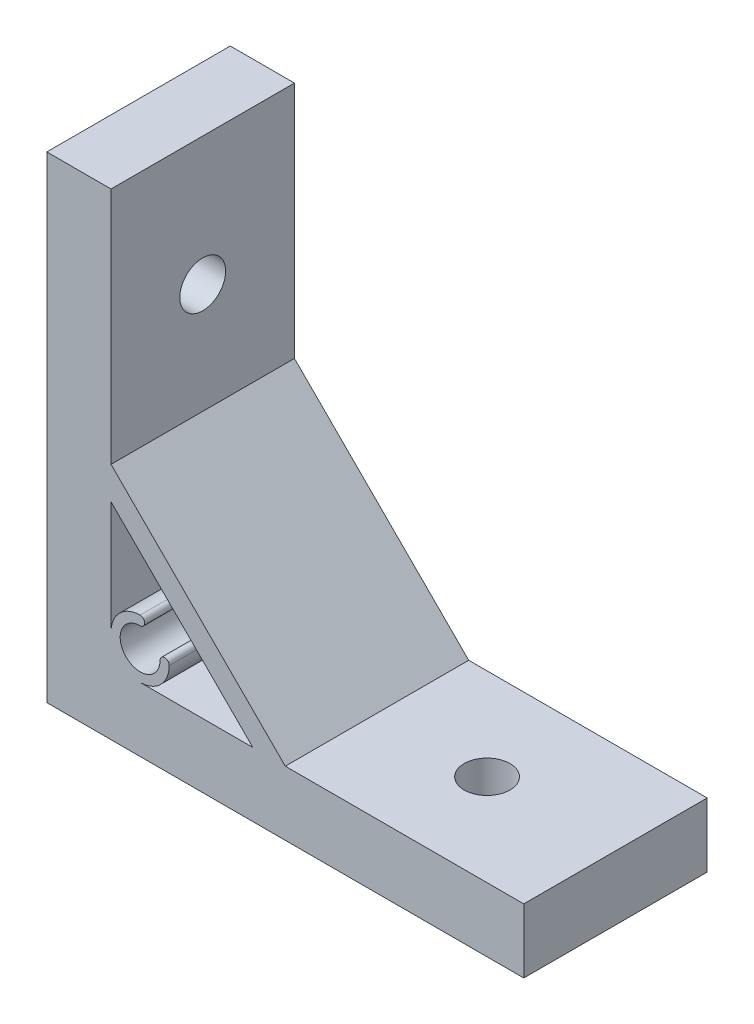
ISO-10303-21;
HEADER;
FILE_DESCRIPTION(('STEP AP214'),'2;1');
FILE_NAME('part.step','',(''),(''),'','','');
FILE_SCHEMA(('AUTOMOTIVE_DESIGN { 1 0 10303 214 1 1 1 1 }'));
ENDSEC;
DATA;
#1=APPLICATION_CONTEXT('core data for automotive mechanical design processes');
#2=APPLICATION_PROTOCOL_DEFINITION('international standard','automotive_design',2000,#1);
#3=PRODUCT_CONTEXT('',#1,'mechanical');
#4=PRODUCT('Part','Part','',(#3));
#5=PRODUCT_RELATED_PRODUCT_CATEGORY('part','',(#4));
#6=PRODUCT_DEFINITION_FORMATION('','',#4);
#7=PRODUCT_DEFINITION_CONTEXT('part definition',#1,'design');
#8=PRODUCT_DEFINITION('design','',#6,#7);
#9=PRODUCT_DEFINITION_SHAPE('','',#8);
#10=(LENGTH_UNIT() NAMED_UNIT(*) SI_UNIT(.MILLI.,.METRE.));
#11=(NAMED_UNIT(*) PLANE_ANGLE_UNIT() SI_UNIT($,.RADIAN.));
#12=(NAMED_UNIT(*) SI_UNIT($,.STERADIAN.) SOLID_ANGLE_UNIT());
#13=UNCERTAINTY_MEASURE_WITH_UNIT(LENGTH_MEASURE(1.E-05),#10,'distance_accuracy_value','');
#14=(GEOMETRIC_REPRESENTATION_CONTEXT(3) GLOBAL_UNCERTAINTY_ASSIGNED_CONTEXT((#13)) GLOBAL_UNIT_ASSIGNED_CONTEXT((#10,
#11,#12)) REPRESENTATION_CONTEXT('',''));
#15=CARTESIAN_POINT('',(0.,0.,0.));
#16=DIRECTION('',(0.,0.,1.));
#17=DIRECTION('',(1.,0.,0.));
#18=AXIS2_PLACEMENT_3D('',#15,#16,#17);
#19=CARTESIAN_POINT('',(10.175,12.85,20.));
#20=DIRECTION('',(0.,0.,-1.));
#21=DIRECTION('',(-1.,0.,0.));
#22=AXIS2_PLACEMENT_3D('',#19,#20,#21);
#23=CYLINDRICAL_SURFACE('',#22,0.5);
#24=CARTESIAN_POINT('',(10.175,12.85,0.));
#25=DIRECTION('',(0.,0.,1.));
#26=DIRECTION('',(1.,0.,0.));
#27=AXIS2_PLACEMENT_3D('',#24,#25,#26);
#28=CIRCLE('',#27,0.5);
#29=CARTESIAN_POINT('',(10.175,12.35,0.));
#30=VERTEX_POINT('',#29);
#31=CARTESIAN_POINT('',(10.175,13.35,0.));
#32=VERTEX_POINT('',#31);
#33=EDGE_CURVE('E208',#30,#32,#28,.T.);
#34=ORIENTED_EDGE('',*,*,#33,.T.);
#35=DIRECTION('',(0.,0.,-1.));
#36=VECTOR('',#35,1.);
#37=CARTESIAN_POINT('',(10.175,13.35,20.));
#38=LINE('',#37,#36);
#39=CARTESIAN_POINT('',(10.175,13.35,20.));
#40=VERTEX_POINT('',#39);
#41=EDGE_CURVE('E11',#40,#32,#38,.T.);
#42=ORIENTED_EDGE('',*,*,#41,.F.);
#43=CARTESIAN_POINT('',(10.175,12.85,20.));
#44=DIRECTION('',(0.,0.,1.));
#45=DIRECTION('',(1.,0.,0.));
#46=AXIS2_PLACEMENT_3D('',#43,#44,#45);
#47=CIRCLE('',#46,0.5);
#48=CARTESIAN_POINT('',(10.175,12.35,20.));
#49=VERTEX_POINT('',#48);
#50=EDGE_CURVE('E294',#49,#40,#47,.T.);
#51=ORIENTED_EDGE('',*,*,#50,.F.);
#52=DIRECTION('',(0.,0.,-1.));
#53=VECTOR('',#52,1.);
#54=CARTESIAN_POINT('',(10.175,12.35,20.));
#55=LINE('',#54,#53);
#56=EDGE_CURVE('E62',#49,#30,#55,.T.);
#57=ORIENTED_EDGE('',*,*,#56,.T.);
#58=EDGE_LOOP('',(#34,#42,#51,#57));
#59=FACE_BOUND('',#58,.T.);
#60=ADVANCED_FACE('F43',(#59),#23,.T.);
#61=CARTESIAN_POINT('',(10.175,10.175,20.));
#62=DIRECTION('',(0.,0.,-1.));
#63=DIRECTION('',(-1.,0.,0.));
#64=AXIS2_PLACEMENT_3D('',#61,#62,#63);
#65=CYLINDRICAL_SURFACE('',#64,3.175);
#66=CARTESIAN_POINT('',(10.175,10.175,0.));
#67=DIRECTION('',(0.,0.,1.));
#68=DIRECTION('',(1.,0.,0.));
#69=AXIS2_PLACEMENT_3D('',#66,#67,#68);
#70=CIRCLE('',#69,3.175);
#71=CARTESIAN_POINT('',(7.00000000000001,10.175,0.));
#72=VERTEX_POINT('',#71);
#73=EDGE_CURVE('E210',#32,#72,#70,.T.);
#74=ORIENTED_EDGE('',*,*,#73,.T.);
#75=DIRECTION('',(0.,0.,-1.));
#76=VECTOR('',#75,1.);
#77=CARTESIAN_POINT('',(7.00000000000001,10.175,20.));
#78=LINE('',#77,#76);
#79=CARTESIAN_POINT('',(7.00000000000001,10.175,20.));
#80=VERTEX_POINT('',#79);
#81=EDGE_CURVE('E53',#80,#72,#78,.T.);
#82=ORIENTED_EDGE('',*,*,#81,.F.);
#83=CARTESIAN_POINT('',(10.175,10.175,20.));
#84=DIRECTION('',(0.,0.,1.));
#85=DIRECTION('',(1.,0.,0.));
#86=AXIS2_PLACEMENT_3D('',#83,#84,#85);
#87=CIRCLE('',#86,3.175);
#88=EDGE_CURVE('E296',#40,#80,#87,.T.);
#89=ORIENTED_EDGE('',*,*,#88,.F.);
#90=ORIENTED_EDGE('',*,*,#41,.T.);
#91=EDGE_LOOP('',(#74,#82,#89,#90));
#92=FACE_BOUND('',#91,.T.);
#93=ADVANCED_FACE('F319',(#92),#65,.T.);
#94=CARTESIAN_POINT('',(7.00000000000001,0.,20.));
#95=DIRECTION('',(1.,0.,0.));
#96=DIRECTION('',(0.,0.,-1.));
#97=AXIS2_PLACEMENT_3D('',#94,#95,#96);
#98=PLANE('',#97);
#99=DIRECTION('',(0.,-1.,0.));
#100=VECTOR('',#99,1.);
#101=CARTESIAN_POINT('',(7.00000000000001,0.,0.));
#102=LINE('',#101,#100);
#103=CARTESIAN_POINT('',(7.00000000000001,22.4644660940699,0.));
#104=VERTEX_POINT('',#103);
#105=EDGE_CURVE('E213',#104,#72,#102,.T.);
#106=ORIENTED_EDGE('',*,*,#105,.F.);
#107=DIRECTION('',(0.,0.,-1.));
#108=VECTOR('',#107,1.);
#109=CARTESIAN_POINT('',(7.00000000000001,22.4644660940699,20.));
#110=LINE('',#109,#108);
#111=CARTESIAN_POINT('',(7.00000000000001,22.4644660940699,20.));
#112=VERTEX_POINT('',#111);
#113=EDGE_CURVE('E234',#112,#104,#110,.T.);
#114=ORIENTED_EDGE('',*,*,#113,.F.);
#115=DIRECTION('',(0.,-1.,0.));
#116=VECTOR('',#115,1.);
#117=CARTESIAN_POINT('',(7.00000000000001,0.,20.));
#118=LINE('',#117,#116);
#119=EDGE_CURVE('E298',#112,#80,#118,.T.);
#120=ORIENTED_EDGE('',*,*,#119,.T.);
#121=ORIENTED_EDGE('',*,*,#81,.T.);
#122=EDGE_LOOP('',(#106,#114,#120,#121));
#123=FACE_BOUND('',#122,.T.);
#124=ADVANCED_FACE('F324',(#123),#98,.T.);
#125=CARTESIAN_POINT('',(14.7322330470355,14.7322330470332,20.));
#126=DIRECTION('',(0.707106781186603,0.707106781186492,0.));
#127=DIRECTION('',(-0.707106781186492,0.707106781186603,0.));
#128=AXIS2_PLACEMENT_3D('',#125,#126,#127);
#129=PLANE('',#128);
#130=DIRECTION('',(0.707106781186492,-0.707106781186603,0.));
#131=VECTOR('',#130,1.);
#132=CARTESIAN_POINT('',(14.7322330470355,14.7322330470332,0.));
#133=LINE('',#132,#131);
#134=CARTESIAN_POINT('',(22.4644660940675,7.,0.));
#135=VERTEX_POINT('',#134);
#136=EDGE_CURVE('E216',#104,#135,#133,.T.);
#137=ORIENTED_EDGE('',*,*,#136,.T.);
#138=DIRECTION('',(0.,0.,-1.));
#139=VECTOR('',#138,1.);
#140=CARTESIAN_POINT('',(22.4644660940675,7.,20.));
#141=LINE('',#140,#139);
#142=CARTESIAN_POINT('',(22.4644660940675,7.,20.));
#143=VERTEX_POINT('',#142);
#144=EDGE_CURVE('E232',#143,#135,#141,.T.);
#145=ORIENTED_EDGE('',*,*,#144,.F.);
#146=DIRECTION('',(0.707106781186492,-0.707106781186603,0.));
#147=VECTOR('',#146,1.);
#148=CARTESIAN_POINT('',(14.7322330470355,14.7322330470332,20.));
#149=LINE('',#148,#147);
#150=EDGE_CURVE('E301',#112,#143,#149,.T.);
#151=ORIENTED_EDGE('',*,*,#150,.F.);
#152=ORIENTED_EDGE('',*,*,#113,.T.);
#153=EDGE_LOOP('',(#137,#145,#151,#152));
#154=FACE_BOUND('',#153,.T.);
#155=ADVANCED_FACE('F447',(#154),#129,.F.);
#156=CARTESIAN_POINT('',(0.,7.,20.));
#157=DIRECTION('',(0.,1.,0.));
#158=DIRECTION('',(0.,0.,1.));
#159=AXIS2_PLACEMENT_3D('',#156,#157,#158);
#160=PLANE('',#159);
#161=DIRECTION('',(1.,0.,0.));
#162=VECTOR('',#161,1.);
#163=CARTESIAN_POINT('',(0.,7.,0.));
#164=LINE('',#163,#162);
#165=CARTESIAN_POINT('',(10.175,7.,0.));
#166=VERTEX_POINT('',#165);
#167=EDGE_CURVE('E219',#166,#135,#164,.T.);
#168=ORIENTED_EDGE('',*,*,#167,.F.);
#169=DIRECTION('',(0.,0.,-1.));
#170=VECTOR('',#169,1.);
#171=CARTESIAN_POINT('',(10.175,7.,20.));
#172=LINE('',#171,#170);
#173=CARTESIAN_POINT('',(10.175,7.,20.));
#174=VERTEX_POINT('',#173);
#175=EDGE_CURVE('E177',#174,#166,#172,.T.);
#176=ORIENTED_EDGE('',*,*,#175,.F.);
#177=DIRECTION('',(1.,0.,0.));
#178=VECTOR('',#177,1.);
#179=CARTESIAN_POINT('',(0.,7.,20.));
#180=LINE('',#179,#178);
#181=EDGE_CURVE('E167',#174,#143,#180,.T.);
#182=ORIENTED_EDGE('',*,*,#181,.T.);
#183=ORIENTED_EDGE('',*,*,#144,.T.);
#184=EDGE_LOOP('',(#168,#176,#182,#183));
#185=FACE_BOUND('',#184,.T.);
#186=ADVANCED_FACE('F304',(#185),#160,.T.);
#187=CARTESIAN_POINT('',(10.175,10.175,20.));
#188=DIRECTION('',(0.,0.,-1.));
#189=DIRECTION('',(-1.,0.,0.));
#190=AXIS2_PLACEMENT_3D('',#187,#188,#189);
#191=CYLINDRICAL_SURFACE('',#190,3.175);
#192=CARTESIAN_POINT('',(10.175,10.175,0.));
#193=DIRECTION('',(0.,0.,1.));
#194=DIRECTION('',(1.,0.,0.));
#195=AXIS2_PLACEMENT_3D('',#192,#193,#194);
#196=CIRCLE('',#195,3.175);
#197=CARTESIAN_POINT('',(13.35,10.175,0.));
#198=VERTEX_POINT('',#197);
#199=EDGE_CURVE('E174',#166,#198,#196,.T.);
#200=ORIENTED_EDGE('',*,*,#199,.T.);
#201=DIRECTION('',(0.,0.,-1.));
#202=VECTOR('',#201,1.);
#203=CARTESIAN_POINT('',(13.35,10.175,20.));
#204=LINE('',#203,#202);
#205=CARTESIAN_POINT('',(13.35,10.175,20.));
#206=VERTEX_POINT('',#205);
#207=EDGE_CURVE('E171',#206,#198,#204,.T.);
#208=ORIENTED_EDGE('',*,*,#207,.F.);
#209=CARTESIAN_POINT('',(10.175,10.175,20.));
#210=DIRECTION('',(0.,0.,1.));
#211=DIRECTION('',(1.,0.,0.));
#212=AXIS2_PLACEMENT_3D('',#209,#210,#211);
#213=CIRCLE('',#212,3.175);
#214=EDGE_CURVE('E159',#174,#206,#213,.T.);
#215=ORIENTED_EDGE('',*,*,#214,.F.);
#216=ORIENTED_EDGE('',*,*,#175,.T.);
#217=EDGE_LOOP('',(#200,#208,#215,#216));
#218=FACE_BOUND('',#217,.T.);
#219=ADVANCED_FACE('F172',(#218),#191,.T.);
#220=CARTESIAN_POINT('',(12.85,10.175,20.));
#221=DIRECTION('',(0.,0.,-1.));
#222=DIRECTION('',(-1.,0.,0.));
#223=AXIS2_PLACEMENT_3D('',#220,#221,#222);
#224=CYLINDRICAL_SURFACE('',#223,0.500000000000001);
#225=CARTESIAN_POINT('',(12.85,10.175,0.));
#226=DIRECTION('',(0.,0.,1.));
#227=DIRECTION('',(1.,0.,0.));
#228=AXIS2_PLACEMENT_3D('',#225,#226,#227);
#229=CIRCLE('',#228,0.500000000000001);
#230=CARTESIAN_POINT('',(12.35,10.175,0.));
#231=VERTEX_POINT('',#230);
#232=EDGE_CURVE('E223',#198,#231,#229,.T.);
#233=ORIENTED_EDGE('',*,*,#232,.T.);
#234=DIRECTION('',(0.,0.,-1.));
#235=VECTOR('',#234,1.);
#236=CARTESIAN_POINT('',(12.35,10.175,20.));
#237=LINE('',#236,#235);
#238=CARTESIAN_POINT('',(12.35,10.175,20.));
#239=VERTEX_POINT('',#238);
#240=EDGE_CURVE('E110',#239,#231,#237,.T.);
#241=ORIENTED_EDGE('',*,*,#240,.F.);
#242=CARTESIAN_POINT('',(12.85,10.175,20.));
#243=DIRECTION('',(0.,0.,1.));
#244=DIRECTION('',(1.,0.,0.));
#245=AXIS2_PLACEMENT_3D('',#242,#243,#244);
#246=CIRCLE('',#245,0.500000000000001);
#247=EDGE_CURVE('E165',#206,#239,#246,.T.);
#248=ORIENTED_EDGE('',*,*,#247,.F.);
#249=ORIENTED_EDGE('',*,*,#207,.T.);
#250=EDGE_LOOP('',(#233,#241,#248,#249));
#251=FACE_BOUND('',#250,.T.);
#252=ADVANCED_FACE('F179',(#251),#224,.T.);
#253=CARTESIAN_POINT('',(7.00000000000001,0.,20.));
#254=DIRECTION('',(1.,0.,0.));
#255=DIRECTION('',(0.,1.,0.));
#256=AXIS2_PLACEMENT_3D('',#253,#254,#255);
#257=PLANE('',#256);
#258=CARTESIAN_POINT('',(7.00000000000001,38.000000000003,9.99999999999999));
#259=DIRECTION('',(1.,0.,0.));
#260=DIRECTION('',(0.,1.,0.));
#261=AXIS2_PLACEMENT_3D('',#258,#259,#260);
#262=CIRCLE('',#261,2.5);
#263=CARTESIAN_POINT('',(7.,40.500000000003,9.99999999999999));
#264=VERTEX_POINT('',#263);
#265=EDGE_CURVE('E350',#264,#264,#262,.T.);
#266=ORIENTED_EDGE('',*,*,#265,.F.);
#267=EDGE_LOOP('',(#266));
#268=FACE_BOUND('',#267,.T.);
#269=DIRECTION('',(0.,-1.,0.));
#270=VECTOR('',#269,1.);
#271=CARTESIAN_POINT('',(7.00000000000001,0.,0.));
#272=LINE('',#271,#270);
#273=CARTESIAN_POINT('',(7.,52.000000000003,0.));
#274=VERTEX_POINT('',#273);
#275=CARTESIAN_POINT('',(7.00000000000001,26.000000000003,0.));
#276=VERTEX_POINT('',#275);
#277=EDGE_CURVE('E186',#274,#276,#272,.T.);
#278=ORIENTED_EDGE('',*,*,#277,.F.);
#279=DIRECTION('',(0.,0.,-1.));
#280=VECTOR('',#279,1.);
#281=CARTESIAN_POINT('',(7.,52.000000000003,20.));
#282=LINE('',#281,#280);
#283=CARTESIAN_POINT('',(7.,52.000000000003,20.));
#284=VERTEX_POINT('',#283);
#285=EDGE_CURVE('E47',#284,#274,#282,.T.);
#286=ORIENTED_EDGE('',*,*,#285,.F.);
#287=DIRECTION('',(0.,-1.,0.));
#288=VECTOR('',#287,1.);
#289=CARTESIAN_POINT('',(7.00000000000001,0.,20.));
#290=LINE('',#289,#288);
#291=CARTESIAN_POINT('',(7.00000000000001,26.000000000003,20.));
#292=VERTEX_POINT('',#291);
#293=EDGE_CURVE('E228',#284,#292,#290,.T.);
#294=ORIENTED_EDGE('',*,*,#293,.T.);
#295=DIRECTION('',(0.,0.,-1.));
#296=VECTOR('',#295,1.);
#297=CARTESIAN_POINT('',(7.00000000000001,26.000000000003,20.));
#298=LINE('',#297,#296);
#299=EDGE_CURVE('E182',#292,#276,#298,.T.);
#300=ORIENTED_EDGE('',*,*,#299,.T.);
#301=EDGE_LOOP('',(#278,#286,#294,#300));
#302=FACE_BOUND('',#301,.T.);
#303=ADVANCED_FACE('F45',(#268,#302),#257,.T.);
#304=CARTESIAN_POINT('',(0.,52.000000000003,20.));
#305=DIRECTION('',(0.,-1.,0.));
#306=DIRECTION('',(0.,0.,-1.));
#307=AXIS2_PLACEMENT_3D('',#304,#305,#306);
#308=PLANE('',#307);
#309=DIRECTION('',(-1.,0.,0.));
#310=VECTOR('',#309,1.);
#311=CARTESIAN_POINT('',(0.,52.000000000003,0.));
#312=LINE('',#311,#310);
#313=CARTESIAN_POINT('',(0.,52.000000000003,0.));
#314=VERTEX_POINT('',#313);
#315=EDGE_CURVE('E189',#274,#314,#312,.T.);
#316=ORIENTED_EDGE('',*,*,#315,.T.);
#317=DIRECTION('',(0.,0.,-1.));
#318=VECTOR('',#317,1.);
#319=CARTESIAN_POINT('',(0.,52.000000000003,20.));
#320=LINE('',#319,#318);
#321=CARTESIAN_POINT('',(0.,52.000000000003,20.));
#322=VERTEX_POINT('',#321);
#323=EDGE_CURVE('E245',#322,#314,#320,.T.);
#324=ORIENTED_EDGE('',*,*,#323,.F.);
#325=DIRECTION('',(-1.,0.,0.));
#326=VECTOR('',#325,1.);
#327=CARTESIAN_POINT('',(0.,52.000000000003,20.));
#328=LINE('',#327,#326);
#329=EDGE_CURVE('E253',#284,#322,#328,.T.);
#330=ORIENTED_EDGE('',*,*,#329,.F.);
#331=ORIENTED_EDGE('',*,*,#285,.T.);
#332=EDGE_LOOP('',(#316,#324,#330,#331));
#333=FACE_BOUND('',#332,.T.);
#334=ADVANCED_FACE('F252',(#333),#308,.F.);
#335=CARTESIAN_POINT('',(0.,0.,20.));
#336=DIRECTION('',(-1.,0.,0.));
#337=DIRECTION('',(0.,0.,1.));
#338=AXIS2_PLACEMENT_3D('',#335,#336,#337);
#339=PLANE('',#338);
#340=CARTESIAN_POINT('',(0.,38.000000000003,9.99999999999999));
#341=DIRECTION('',(-1.,0.,0.));
#342=DIRECTION('',(0.,0.,1.));
#343=AXIS2_PLACEMENT_3D('',#340,#341,#342);
#344=CIRCLE('',#343,2.5);
#345=CARTESIAN_POINT('',(0.,40.500000000003,9.99999999999999));
#346=VERTEX_POINT('',#345);
#347=EDGE_CURVE('E190',#346,#346,#344,.F.);
#348=ORIENTED_EDGE('',*,*,#347,.T.);
#349=EDGE_LOOP('',(#348));
#350=FACE_BOUND('',#349,.T.);
#351=DIRECTION('',(0.,1.,0.));
#352=VECTOR('',#351,1.);
#353=CARTESIAN_POINT('',(0.,0.,0.));
#354=LINE('',#353,#352);
#355=CARTESIAN_POINT('',(0.,0.,0.));
#356=VERTEX_POINT('',#355);
#357=EDGE_CURVE('E193',#356,#314,#354,.T.);
#358=ORIENTED_EDGE('',*,*,#357,.F.);
#359=DIRECTION('',(0.,0.,-1.));
#360=VECTOR('',#359,1.);
#361=CARTESIAN_POINT('',(0.,0.,20.));
#362=LINE('',#361,#360);
#363=CARTESIAN_POINT('',(0.,0.,20.));
#364=VERTEX_POINT('',#363);
#365=EDGE_CURVE('E244',#364,#356,#362,.T.);
#366=ORIENTED_EDGE('',*,*,#365,.F.);
#367=DIRECTION('',(0.,1.,0.));
#368=VECTOR('',#367,1.);
#369=CARTESIAN_POINT('',(0.,0.,20.));
#370=LINE('',#369,#368);
#371=EDGE_CURVE('E283',#364,#322,#370,.T.);
#372=ORIENTED_EDGE('',*,*,#371,.T.);
#373=ORIENTED_EDGE('',*,*,#323,.T.);
#374=EDGE_LOOP('',(#358,#366,#372,#373));
#375=FACE_BOUND('',#374,.T.);
#376=ADVANCED_FACE('F281',(#350,#375),#339,.T.);
#377=CARTESIAN_POINT('',(0.,0.,20.));
#378=DIRECTION('',(0.,1.,0.));
#379=DIRECTION('',(0.,0.,1.));
#380=AXIS2_PLACEMENT_3D('',#377,#378,#379);
#381=PLANE('',#380);
#382=CARTESIAN_POINT('',(38.000000000003,-3.96571664396137E-13,9.99999999999999));
#383=DIRECTION('',(0.,1.,0.));
#384=DIRECTION('',(0.,0.,1.));
#385=AXIS2_PLACEMENT_3D('',#382,#383,#384);
#386=CIRCLE('',#385,2.5);
#387=CARTESIAN_POINT('',(40.500000000003,-4.22405166400353E-13,9.99999999999999));
#388=VERTEX_POINT('',#387);
#389=EDGE_CURVE('E352',#388,#388,#386,.F.);
#390=ORIENTED_EDGE('',*,*,#389,.F.);
#391=EDGE_LOOP('',(#390));
#392=FACE_BOUND('',#391,.T.);
#393=DIRECTION('',(1.,0.,0.));
#394=VECTOR('',#393,1.);
#395=CARTESIAN_POINT('',(0.,0.,0.));
#396=LINE('',#395,#394);
#397=CARTESIAN_POINT('',(52.,0.,0.));
#398=VERTEX_POINT('',#397);
#399=EDGE_CURVE('E196',#356,#398,#396,.T.);
#400=ORIENTED_EDGE('',*,*,#399,.T.);
#401=DIRECTION('',(0.,0.,-1.));
#402=VECTOR('',#401,1.);
#403=CARTESIAN_POINT('',(52.,0.,20.));
#404=LINE('',#403,#402);
#405=CARTESIAN_POINT('',(52.,0.,20.));
#406=VERTEX_POINT('',#405);
#407=EDGE_CURVE('E242',#406,#398,#404,.T.);
#408=ORIENTED_EDGE('',*,*,#407,.F.);
#409=DIRECTION('',(1.,0.,0.));
#410=VECTOR('',#409,1.);
#411=CARTESIAN_POINT('',(0.,0.,20.));
#412=LINE('',#411,#410);
#413=EDGE_CURVE('E284',#364,#406,#412,.T.);
#414=ORIENTED_EDGE('',*,*,#413,.F.);
#415=ORIENTED_EDGE('',*,*,#365,.T.);
#416=EDGE_LOOP('',(#400,#408,#414,#415));
#417=FACE_BOUND('',#416,.T.);
#418=ADVANCED_FACE('F280',(#392,#417),#381,.F.);
#419=CARTESIAN_POINT('',(52.,0.,20.));
#420=DIRECTION('',(1.,0.,0.));
#421=DIRECTION('',(0.,0.,-1.));
#422=AXIS2_PLACEMENT_3D('',#419,#420,#421);
#423=PLANE('',#422);
#424=DIRECTION('',(0.,-1.,0.));
#425=VECTOR('',#424,1.);
#426=CARTESIAN_POINT('',(52.,0.,0.));
#427=LINE('',#426,#425);
#428=CARTESIAN_POINT('',(52.,7.,0.));
#429=VERTEX_POINT('',#428);
#430=EDGE_CURVE('E199',#429,#398,#427,.T.);
#431=ORIENTED_EDGE('',*,*,#430,.F.);
#432=DIRECTION('',(0.,0.,-1.));
#433=VECTOR('',#432,1.);
#434=CARTESIAN_POINT('',(52.,7.,20.));
#435=LINE('',#434,#433);
#436=CARTESIAN_POINT('',(52.,7.,20.));
#437=VERTEX_POINT('',#436);
#438=EDGE_CURVE('E240',#437,#429,#435,.T.);
#439=ORIENTED_EDGE('',*,*,#438,.F.);
#440=DIRECTION('',(0.,-1.,0.));
#441=VECTOR('',#440,1.);
#442=CARTESIAN_POINT('',(52.,0.,20.));
#443=LINE('',#442,#441);
#444=EDGE_CURVE('E277',#437,#406,#443,.T.);
#445=ORIENTED_EDGE('',*,*,#444,.T.);
#446=ORIENTED_EDGE('',*,*,#407,.T.);
#447=EDGE_LOOP('',(#431,#439,#445,#446));
#448=FACE_BOUND('',#447,.T.);
#449=ADVANCED_FACE('F275',(#448),#423,.T.);
#450=CARTESIAN_POINT('',(0.,7.,20.));
#451=DIRECTION('',(0.,1.,0.));
#452=DIRECTION('',(0.,0.,1.));
#453=AXIS2_PLACEMENT_3D('',#450,#451,#452);
#454=PLANE('',#453);
#455=CARTESIAN_POINT('',(38.000000000003,6.99999999999961,9.99999999999999));
#456=DIRECTION('',(0.,-1.,0.));
#457=DIRECTION('',(1.,0.,0.));
#458=AXIS2_PLACEMENT_3D('',#455,#456,#457);
#459=CIRCLE('',#458,2.5);
#460=CARTESIAN_POINT('',(40.500000000003,6.99999999999958,9.99999999999999));
#461=VERTEX_POINT('',#460);
#462=EDGE_CURVE('E357',#461,#461,#459,.T.);
#463=ORIENTED_EDGE('',*,*,#462,.T.);
#464=EDGE_LOOP('',(#463));
#465=FACE_BOUND('',#464,.T.);
#466=DIRECTION('',(1.,0.,0.));
#467=VECTOR('',#466,1.);
#468=CARTESIAN_POINT('',(0.,7.,0.));
#469=LINE('',#468,#467);
#470=CARTESIAN_POINT('',(26.,7.,0.));
#471=VERTEX_POINT('',#470);
#472=EDGE_CURVE('E202',#471,#429,#469,.T.);
#473=ORIENTED_EDGE('',*,*,#472,.F.);
#474=DIRECTION('',(0.,0.,-1.));
#475=VECTOR('',#474,1.);
#476=CARTESIAN_POINT('',(26.,7.,20.));
#477=LINE('',#476,#475);
#478=CARTESIAN_POINT('',(26.,7.,20.));
#479=VERTEX_POINT('',#478);
#480=EDGE_CURVE('E238',#479,#471,#477,.T.);
#481=ORIENTED_EDGE('',*,*,#480,.F.);
#482=DIRECTION('',(1.,0.,0.));
#483=VECTOR('',#482,1.);
#484=CARTESIAN_POINT('',(0.,7.,20.));
#485=LINE('',#484,#483);
#486=EDGE_CURVE('E271',#479,#437,#485,.T.);
#487=ORIENTED_EDGE('',*,*,#486,.T.);
#488=ORIENTED_EDGE('',*,*,#438,.T.);
#489=EDGE_LOOP('',(#473,#481,#487,#488));
#490=FACE_BOUND('',#489,.T.);
#491=ADVANCED_FACE('F268',(#465,#490),#454,.T.);
#492=CARTESIAN_POINT('',(16.500000000002,16.4999999999995,20.));
#493=DIRECTION('',(0.707106781186603,0.707106781186492,0.));
#494=DIRECTION('',(-0.707106781186492,0.707106781186603,0.));
#495=AXIS2_PLACEMENT_3D('',#492,#493,#494);
#496=PLANE('',#495);
#497=DIRECTION('',(0.707106781186492,-0.707106781186603,0.));
#498=VECTOR('',#497,1.);
#499=CARTESIAN_POINT('',(16.500000000002,16.4999999999995,0.));
#500=LINE('',#499,#498);
#501=EDGE_CURVE('E205',#276,#471,#500,.T.);
#502=ORIENTED_EDGE('',*,*,#501,.F.);
#503=ORIENTED_EDGE('',*,*,#299,.F.);
#504=DIRECTION('',(0.707106781186492,-0.707106781186603,0.));
#505=VECTOR('',#504,1.);
#506=CARTESIAN_POINT('',(16.500000000002,16.4999999999995,20.));
#507=LINE('',#506,#505);
#508=EDGE_CURVE('E264',#292,#479,#507,.T.);
#509=ORIENTED_EDGE('',*,*,#508,.T.);
#510=ORIENTED_EDGE('',*,*,#480,.T.);
#511=EDGE_LOOP('',(#502,#503,#509,#510));
#512=FACE_BOUND('',#511,.T.);
#513=ADVANCED_FACE('F263',(#512),#496,.T.);
#514=CARTESIAN_POINT('',(10.175,10.175,20.));
#515=DIRECTION('',(0.,0.,-1.));
#516=DIRECTION('',(-1.,0.,0.));
#517=AXIS2_PLACEMENT_3D('',#514,#515,#516);
#518=CYLINDRICAL_SURFACE('',#517,2.175);
#519=CARTESIAN_POINT('',(10.175,10.175,0.));
#520=DIRECTION('',(0.,0.,1.));
#521=DIRECTION('',(1.,0.,0.));
#522=AXIS2_PLACEMENT_3D('',#519,#520,#521);
#523=CIRCLE('',#522,2.175);
#524=EDGE_CURVE('E225',#30,#231,#523,.T.);
#525=ORIENTED_EDGE('',*,*,#524,.F.);
#526=ORIENTED_EDGE('',*,*,#56,.F.);
#527=CARTESIAN_POINT('',(10.175,10.175,20.));
#528=DIRECTION('',(0.,0.,1.));
#529=DIRECTION('',(1.,0.,0.));
#530=AXIS2_PLACEMENT_3D('',#527,#528,#529);
#531=CIRCLE('',#530,2.175);
#532=EDGE_CURVE('E180',#49,#239,#531,.T.);
#533=ORIENTED_EDGE('',*,*,#532,.T.);
#534=ORIENTED_EDGE('',*,*,#240,.T.);
#535=EDGE_LOOP('',(#525,#526,#533,#534));
#536=FACE_BOUND('',#535,.T.);
#537=ADVANCED_FACE('F307',(#536),#518,.F.);
#538=CARTESIAN_POINT('',(0.,0.,20.));
#539=DIRECTION('',(0.,0.,1.));
#540=DIRECTION('',(1.,0.,0.));
#541=AXIS2_PLACEMENT_3D('',#538,#539,#540);
#542=PLANE('',#541);
#543=ORIENTED_EDGE('',*,*,#293,.F.);
#544=ORIENTED_EDGE('',*,*,#329,.T.);
#545=ORIENTED_EDGE('',*,*,#371,.F.);
#546=ORIENTED_EDGE('',*,*,#413,.T.);
#547=ORIENTED_EDGE('',*,*,#444,.F.);
#548=ORIENTED_EDGE('',*,*,#486,.F.);
#549=ORIENTED_EDGE('',*,*,#508,.F.);
#550=EDGE_LOOP('',(#543,#544,#545,#546,#547,#548,#549));
#551=FACE_BOUND('',#550,.T.);
#552=ORIENTED_EDGE('',*,*,#50,.T.);
#553=ORIENTED_EDGE('',*,*,#88,.T.);
#554=ORIENTED_EDGE('',*,*,#119,.F.);
#555=ORIENTED_EDGE('',*,*,#150,.T.);
#556=ORIENTED_EDGE('',*,*,#181,.F.);
#557=ORIENTED_EDGE('',*,*,#214,.T.);
#558=ORIENTED_EDGE('',*,*,#247,.T.);
#559=ORIENTED_EDGE('',*,*,#532,.F.);
#560=EDGE_LOOP('',(#552,#553,#554,#555,#556,#557,#558,#559));
#561=FACE_BOUND('',#560,.T.);
#562=ADVANCED_FACE('F162',(#551,#561),#542,.T.);
#563=CARTESIAN_POINT('',(0.,0.,0.));
#564=DIRECTION('',(0.,0.,1.));
#565=DIRECTION('',(1.,0.,0.));
#566=AXIS2_PLACEMENT_3D('',#563,#564,#565);
#567=PLANE('',#566);
#568=ORIENTED_EDGE('',*,*,#277,.T.);
#569=ORIENTED_EDGE('',*,*,#501,.T.);
#570=ORIENTED_EDGE('',*,*,#472,.T.);
#571=ORIENTED_EDGE('',*,*,#430,.T.);
#572=ORIENTED_EDGE('',*,*,#399,.F.);
#573=ORIENTED_EDGE('',*,*,#357,.T.);
#574=ORIENTED_EDGE('',*,*,#315,.F.);
#575=EDGE_LOOP('',(#568,#569,#570,#571,#572,#573,#574));
#576=FACE_BOUND('',#575,.T.);
#577=ORIENTED_EDGE('',*,*,#33,.F.);
#578=ORIENTED_EDGE('',*,*,#524,.T.);
#579=ORIENTED_EDGE('',*,*,#232,.F.);
#580=ORIENTED_EDGE('',*,*,#199,.F.);
#581=ORIENTED_EDGE('',*,*,#167,.T.);
#582=ORIENTED_EDGE('',*,*,#136,.F.);
#583=ORIENTED_EDGE('',*,*,#105,.T.);
#584=ORIENTED_EDGE('',*,*,#73,.F.);
#585=EDGE_LOOP('',(#577,#578,#579,#580,#581,#582,#583,#584));
#586=FACE_BOUND('',#585,.T.);
#587=ADVANCED_FACE('F256',(#576,#586),#567,.F.);
#588=CARTESIAN_POINT('',(-7.07106781186548,38.000000000003,9.99999999999999));
#589=DIRECTION('',(1.,0.,0.));
#590=DIRECTION('',(0.,1.,0.));
#591=AXIS2_PLACEMENT_3D('',#588,#589,#590);
#592=CYLINDRICAL_SURFACE('',#591,2.5);
#593=CARTESIAN_POINT('',(7.,40.500000000003,9.99999999999999));
#594=CARTESIAN_POINT('',(6.92708333333334,40.500000000003,9.99999999999999));
#595=CARTESIAN_POINT('',(6.85416666666667,40.500000000003,9.99999999999999));
#596=CARTESIAN_POINT('',(6.70833333333334,40.500000000003,9.99999999999999));
#597=CARTESIAN_POINT('',(6.63541666666667,40.500000000003,9.99999999999999));
#598=CARTESIAN_POINT('',(6.48958333333334,40.500000000003,9.99999999999999));
#599=CARTESIAN_POINT('',(6.41666666666667,40.500000000003,9.99999999999999));
#600=CARTESIAN_POINT('',(6.27083333333334,40.500000000003,9.99999999999999));
#601=CARTESIAN_POINT('',(6.19791666666667,40.500000000003,9.99999999999999));
#602=CARTESIAN_POINT('',(6.05208333333334,40.500000000003,9.99999999999999));
#603=CARTESIAN_POINT('',(5.97916666666667,40.500000000003,9.99999999999999));
#604=CARTESIAN_POINT('',(5.83333333333334,40.500000000003,9.99999999999999));
#605=CARTESIAN_POINT('',(5.76041666666667,40.500000000003,9.99999999999999));
#606=CARTESIAN_POINT('',(5.61458333333334,40.500000000003,9.99999999999999));
#607=CARTESIAN_POINT('',(5.54166666666667,40.500000000003,9.99999999999999));
#608=CARTESIAN_POINT('',(5.39583333333334,40.500000000003,9.99999999999999));
#609=CARTESIAN_POINT('',(5.32291666666667,40.500000000003,9.99999999999999));
#610=CARTESIAN_POINT('',(5.17708333333334,40.500000000003,9.99999999999999));
#611=CARTESIAN_POINT('',(5.10416666666667,40.500000000003,9.99999999999999));
#612=CARTESIAN_POINT('',(4.95833333333334,40.500000000003,9.99999999999999));
#613=CARTESIAN_POINT('',(4.88541666666667,40.500000000003,9.99999999999999));
#614=CARTESIAN_POINT('',(4.73958333333333,40.500000000003,9.99999999999999));
#615=CARTESIAN_POINT('',(4.66666666666667,40.500000000003,9.99999999999999));
#616=CARTESIAN_POINT('',(4.52083333333333,40.500000000003,9.99999999999999));
#617=CARTESIAN_POINT('',(4.44791666666667,40.500000000003,9.99999999999999));
#618=CARTESIAN_POINT('',(4.30208333333333,40.500000000003,9.99999999999999));
#619=CARTESIAN_POINT('',(4.22916666666667,40.500000000003,9.99999999999999));
#620=CARTESIAN_POINT('',(4.08333333333333,40.500000000003,9.99999999999999));
#621=CARTESIAN_POINT('',(4.01041666666667,40.500000000003,9.99999999999999));
#622=CARTESIAN_POINT('',(3.86458333333333,40.500000000003,9.99999999999999));
#623=CARTESIAN_POINT('',(3.79166666666667,40.500000000003,9.99999999999999));
#624=CARTESIAN_POINT('',(3.64583333333333,40.500000000003,9.99999999999999));
#625=CARTESIAN_POINT('',(3.57291666666667,40.500000000003,9.99999999999999));
#626=CARTESIAN_POINT('',(3.42708333333333,40.500000000003,9.99999999999999));
#627=CARTESIAN_POINT('',(3.35416666666667,40.500000000003,9.99999999999999));
#628=CARTESIAN_POINT('',(3.20833333333333,40.500000000003,9.99999999999999));
#629=CARTESIAN_POINT('',(3.13541666666667,40.500000000003,9.99999999999999));
#630=CARTESIAN_POINT('',(2.98958333333333,40.500000000003,9.99999999999999));
#631=CARTESIAN_POINT('',(2.91666666666667,40.500000000003,9.99999999999999));
#632=CARTESIAN_POINT('',(2.77083333333333,40.500000000003,9.99999999999999));
#633=CARTESIAN_POINT('',(2.69791666666667,40.500000000003,9.99999999999999));
#634=CARTESIAN_POINT('',(2.55208333333333,40.500000000003,9.99999999999999));
#635=CARTESIAN_POINT('',(2.47916666666667,40.500000000003,9.99999999999999));
#636=CARTESIAN_POINT('',(2.33333333333333,40.500000000003,9.99999999999999));
#637=CARTESIAN_POINT('',(2.26041666666667,40.500000000003,9.99999999999999));
#638=CARTESIAN_POINT('',(2.11458333333333,40.500000000003,9.99999999999999));
#639=CARTESIAN_POINT('',(2.04166666666667,40.500000000003,9.99999999999999));
#640=CARTESIAN_POINT('',(1.89583333333333,40.500000000003,9.99999999999999));
#641=CARTESIAN_POINT('',(1.82291666666667,40.500000000003,9.99999999999999));
#642=CARTESIAN_POINT('',(1.67708333333333,40.500000000003,9.99999999999999));
#643=CARTESIAN_POINT('',(1.60416666666667,40.500000000003,9.99999999999999));
#644=CARTESIAN_POINT('',(1.45833333333333,40.500000000003,9.99999999999999));
#645=CARTESIAN_POINT('',(1.38541666666667,40.500000000003,9.99999999999999));
#646=CARTESIAN_POINT('',(1.23958333333333,40.500000000003,9.99999999999999));
#647=CARTESIAN_POINT('',(1.16666666666667,40.500000000003,9.99999999999999));
#648=CARTESIAN_POINT('',(1.02083333333333,40.500000000003,9.99999999999999));
#649=CARTESIAN_POINT('',(0.947916666666667,40.500000000003,9.99999999999999));
#650=CARTESIAN_POINT('',(0.802083333333333,40.500000000003,9.99999999999999));
#651=CARTESIAN_POINT('',(0.729166666666667,40.500000000003,9.99999999999999));
#652=CARTESIAN_POINT('',(0.583333333333334,40.500000000003,9.99999999999999));
#653=CARTESIAN_POINT('',(0.510416666666667,40.500000000003,9.99999999999999));
#654=CARTESIAN_POINT('',(0.364583333333334,40.500000000003,9.99999999999999));
#655=CARTESIAN_POINT('',(0.291666666666667,40.500000000003,9.99999999999999));
#656=CARTESIAN_POINT('',(0.145833333333333,40.500000000003,9.99999999999999));
#657=CARTESIAN_POINT('',(0.0729166666666666,40.500000000003,9.99999999999999));
#658=CARTESIAN_POINT('',(0.,40.500000000003,9.99999999999999));
#659=B_SPLINE_CURVE_WITH_KNOTS('',3,(#593,#594,#595,#596,#597,#598,#599,#600,#601,#602,#603,
#604,#605,#606,#607,#608,#609,#610,#611,#612,#613,#614,#615,#616,#617,#618,#619,#620,#621,#622,
#623,#624,#625,#626,#627,#628,#629,#630,#631,#632,#633,#634,#635,#636,#637,#638,#639,#640,#641,
#642,#643,#644,#645,#646,#647,#648,#649,#650,#651,#652,#653,#654,#655,#656,#657,#658),
.UNSPECIFIED.,.F.,.F.,(4,2,2,2,2,2,2,2,2,2,2,2,2,2,2,2,2,2,2,2,2,2,2,2,2,2,2,2,2,2,2,2,4),(0.,
0.21875,0.4375,0.656250000000001,0.875000000000001,1.09375,1.3125,1.53125,1.75,1.96875,2.1875,
2.40625,2.625,2.84375,3.0625,3.28125,3.5,3.71875,3.9375,4.15625,4.375,4.59375,4.8125,5.03125,
5.25,5.46875,5.6875,5.90625,6.125,6.34375,6.5625,6.78125,7.),.UNSPECIFIED.);
#660=EDGE_CURVE('BSEAM366',#264,#346,#659,.T.);
#661=ORIENTED_EDGE('',*,*,#265,.T.);
#662=ORIENTED_EDGE('',*,*,#347,.F.);
#663=ORIENTED_EDGE('',*,*,#660,.T.);
#664=ORIENTED_EDGE('',*,*,#660,.F.);
#665=EDGE_LOOP('',(#661,#663,#662,#664));
#666=FACE_BOUND('',#665,.T.);
#667=ADVANCED_FACE('F366',(#666),#592,.F.);
#668=CARTESIAN_POINT('',(38.0000000000029,-7.07106781186588,9.99999999999999));
#669=DIRECTION('',(0.,1.,0.));
#670=DIRECTION('',(1.,0.,0.));
#671=AXIS2_PLACEMENT_3D('',#668,#669,#670);
#672=CYLINDRICAL_SURFACE('',#671,2.5);
#673=CARTESIAN_POINT('',(40.500000000003,6.99999999999958,9.99999999999999));
#674=CARTESIAN_POINT('',(40.500000000003,6.92708333333291,9.99999999999999));
#675=CARTESIAN_POINT('',(40.500000000003,6.85416666666625,9.99999999999999));
#676=CARTESIAN_POINT('',(40.500000000003,6.70833333333291,9.99999999999999));
#677=CARTESIAN_POINT('',(40.500000000003,6.63541666666625,9.99999999999999));
#678=CARTESIAN_POINT('',(40.500000000003,6.48958333333291,9.99999999999999));
#679=CARTESIAN_POINT('',(40.500000000003,6.41666666666625,9.99999999999999));
#680=CARTESIAN_POINT('',(40.500000000003,6.27083333333291,9.99999999999999));
#681=CARTESIAN_POINT('',(40.500000000003,6.19791666666625,9.99999999999999));
#682=CARTESIAN_POINT('',(40.500000000003,6.05208333333291,9.99999999999999));
#683=CARTESIAN_POINT('',(40.500000000003,5.97916666666625,9.99999999999999));
#684=CARTESIAN_POINT('',(40.500000000003,5.83333333333291,9.99999999999999));
#685=CARTESIAN_POINT('',(40.500000000003,5.76041666666625,9.99999999999999));
#686=CARTESIAN_POINT('',(40.500000000003,5.61458333333291,9.99999999999999));
#687=CARTESIAN_POINT('',(40.500000000003,5.54166666666625,9.99999999999999));
#688=CARTESIAN_POINT('',(40.500000000003,5.39583333333291,9.99999999999999));
#689=CARTESIAN_POINT('',(40.500000000003,5.32291666666625,9.99999999999999));
#690=CARTESIAN_POINT('',(40.500000000003,5.17708333333291,9.99999999999999));
#691=CARTESIAN_POINT('',(40.500000000003,5.10416666666625,9.99999999999999));
#692=CARTESIAN_POINT('',(40.500000000003,4.95833333333291,9.99999999999999));
#693=CARTESIAN_POINT('',(40.500000000003,4.88541666666625,9.99999999999999));
#694=CARTESIAN_POINT('',(40.500000000003,4.73958333333291,9.99999999999999));
#695=CARTESIAN_POINT('',(40.500000000003,4.66666666666625,9.99999999999999));
#696=CARTESIAN_POINT('',(40.500000000003,4.52083333333291,9.99999999999999));
#697=CARTESIAN_POINT('',(40.500000000003,4.44791666666625,9.99999999999999));
#698=CARTESIAN_POINT('',(40.500000000003,4.30208333333291,9.99999999999999));
#699=CARTESIAN_POINT('',(40.500000000003,4.22916666666625,9.99999999999999));
#700=CARTESIAN_POINT('',(40.500000000003,4.08333333333291,9.99999999999999));
#701=CARTESIAN_POINT('',(40.500000000003,4.01041666666625,9.99999999999999));
#702=CARTESIAN_POINT('',(40.500000000003,3.86458333333291,9.99999999999999));
#703=CARTESIAN_POINT('',(40.500000000003,3.79166666666625,9.99999999999999));
#704=CARTESIAN_POINT('',(40.500000000003,3.64583333333291,9.99999999999999));
#705=CARTESIAN_POINT('',(40.500000000003,3.57291666666625,9.99999999999999));
#706=CARTESIAN_POINT('',(40.500000000003,3.42708333333291,9.99999999999999));
#707=CARTESIAN_POINT('',(40.500000000003,3.35416666666624,9.99999999999999));
#708=CARTESIAN_POINT('',(40.500000000003,3.20833333333291,9.99999999999999));
#709=CARTESIAN_POINT('',(40.500000000003,3.13541666666624,9.99999999999999));
#710=CARTESIAN_POINT('',(40.500000000003,2.98958333333291,9.99999999999999));
#711=CARTESIAN_POINT('',(40.500000000003,2.91666666666624,9.99999999999999));
#712=CARTESIAN_POINT('',(40.500000000003,2.77083333333291,9.99999999999999));
#713=CARTESIAN_POINT('',(40.500000000003,2.69791666666624,9.99999999999999));
#714=CARTESIAN_POINT('',(40.500000000003,2.55208333333291,9.99999999999999));
#715=CARTESIAN_POINT('',(40.500000000003,2.47916666666624,9.99999999999999));
#716=CARTESIAN_POINT('',(40.500000000003,2.33333333333291,9.99999999999999));
#717=CARTESIAN_POINT('',(40.500000000003,2.26041666666624,9.99999999999999));
#718=CARTESIAN_POINT('',(40.500000000003,2.11458333333291,9.99999999999999));
#719=CARTESIAN_POINT('',(40.500000000003,2.04166666666624,9.99999999999999));
#720=CARTESIAN_POINT('',(40.500000000003,1.89583333333291,9.99999999999999));
#721=CARTESIAN_POINT('',(40.500000000003,1.82291666666624,9.99999999999999));
#722=CARTESIAN_POINT('',(40.500000000003,1.67708333333291,9.99999999999999));
#723=CARTESIAN_POINT('',(40.500000000003,1.60416666666624,9.99999999999999));
#724=CARTESIAN_POINT('',(40.500000000003,1.45833333333291,9.99999999999999));
#725=CARTESIAN_POINT('',(40.500000000003,1.38541666666624,9.99999999999999));
#726=CARTESIAN_POINT('',(40.500000000003,1.23958333333291,9.99999999999999));
#727=CARTESIAN_POINT('',(40.500000000003,1.16666666666624,9.99999999999999));
#728=CARTESIAN_POINT('',(40.500000000003,1.02083333333291,9.99999999999999));
#729=CARTESIAN_POINT('',(40.500000000003,0.947916666666244,9.99999999999999));
#730=CARTESIAN_POINT('',(40.500000000003,0.802083333332911,9.99999999999999));
#731=CARTESIAN_POINT('',(40.500000000003,0.729166666666245,9.99999999999999));
#732=CARTESIAN_POINT('',(40.500000000003,0.583333333332911,9.99999999999999));
#733=CARTESIAN_POINT('',(40.500000000003,0.510416666666245,9.99999999999999));
#734=CARTESIAN_POINT('',(40.500000000003,0.364583333332911,9.99999999999999));
#735=CARTESIAN_POINT('',(40.500000000003,0.291666666666245,9.99999999999999));
#736=CARTESIAN_POINT('',(40.500000000003,0.145833333332911,9.99999999999999));
#737=CARTESIAN_POINT('',(40.500000000003,0.0729166666662442,9.99999999999999));
#738=CARTESIAN_POINT('',(40.500000000003,-4.22405166400353E-13,9.99999999999999));
#739=B_SPLINE_CURVE_WITH_KNOTS('',3,(#673,#674,#675,#676,#677,#678,#679,#680,#681,#682,#683,
#684,#685,#686,#687,#688,#689,#690,#691,#692,#693,#694,#695,#696,#697,#698,#699,#700,#701,#702,
#703,#704,#705,#706,#707,#708,#709,#710,#711,#712,#713,#714,#715,#716,#717,#718,#719,#720,#721,
#722,#723,#724,#725,#726,#727,#728,#729,#730,#731,#732,#733,#734,#735,#736,#737,#738),
.UNSPECIFIED.,.F.,.F.,(4,2,2,2,2,2,2,2,2,2,2,2,2,2,2,2,2,2,2,2,2,2,2,2,2,2,2,2,2,2,2,2,4),(0.,
0.21875,0.4375,0.656250000000001,0.875000000000001,1.09375,1.3125,1.53125,1.75,1.96875,2.1875,
2.40625,2.625,2.84375,3.0625,3.28125,3.5,3.71875,3.9375,4.15625,4.375,4.59375,4.8125,5.03125,
5.25,5.46875,5.6875,5.90625,6.125,6.34375,6.5625,6.78125,7.),.UNSPECIFIED.);
#740=EDGE_CURVE('BSEAM363',#461,#388,#739,.T.);
#741=ORIENTED_EDGE('',*,*,#462,.F.);
#742=ORIENTED_EDGE('',*,*,#389,.T.);
#743=ORIENTED_EDGE('',*,*,#740,.T.);
#744=ORIENTED_EDGE('',*,*,#740,.F.);
#745=EDGE_LOOP('',(#741,#743,#742,#744));
#746=FACE_BOUND('',#745,.T.);
#747=ADVANCED_FACE('F363',(#746),#672,.F.);
#748=CLOSED_SHELL('',(#60,#93,#124,#155,#186,#219,#252,#303,#334,#376,#418,#449,#491,#513,#537,
#562,#587,#667,#747));
#749=MANIFOLD_SOLID_BREP('B2',#748);
#750=ADVANCED_BREP_SHAPE_REPRESENTATION('',(#18,#749),#14);
#751=SHAPE_DEFINITION_REPRESENTATION(#9,#750);
ENDSEC;
END-ISO-10303-21;
